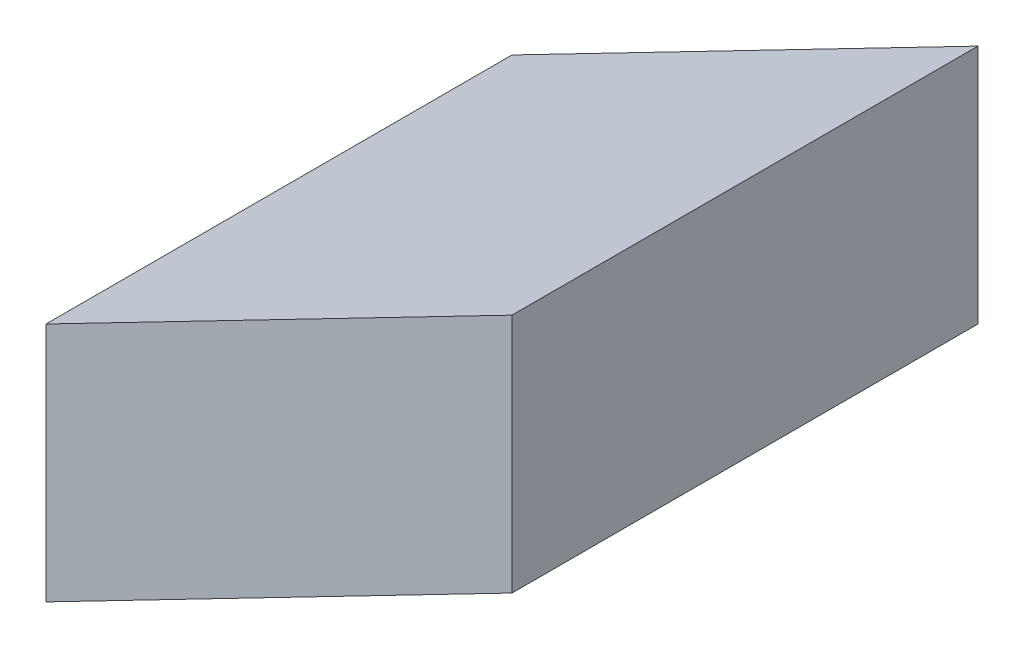
ISO-10303-21;
HEADER;
FILE_DESCRIPTION(('STEP AP214'),'2;1');
FILE_NAME('part.step','',(''),(''),'','','');
FILE_SCHEMA(('AUTOMOTIVE_DESIGN { 1 0 10303 214 1 1 1 1 }'));
ENDSEC;
DATA;
#1=APPLICATION_CONTEXT('core data for automotive mechanical design processes');
#2=APPLICATION_PROTOCOL_DEFINITION('international standard','automotive_design',2000,#1);
#3=PRODUCT_CONTEXT('',#1,'mechanical');
#4=PRODUCT('Part','Part','',(#3));
#5=PRODUCT_RELATED_PRODUCT_CATEGORY('part','',(#4));
#6=PRODUCT_DEFINITION_FORMATION('','',#4);
#7=PRODUCT_DEFINITION_CONTEXT('part definition',#1,'design');
#8=PRODUCT_DEFINITION('design','',#6,#7);
#9=PRODUCT_DEFINITION_SHAPE('','',#8);
#10=(LENGTH_UNIT() NAMED_UNIT(*) SI_UNIT(.MILLI.,.METRE.));
#11=(NAMED_UNIT(*) PLANE_ANGLE_UNIT() SI_UNIT($,.RADIAN.));
#12=(NAMED_UNIT(*) SI_UNIT($,.STERADIAN.) SOLID_ANGLE_UNIT());
#13=UNCERTAINTY_MEASURE_WITH_UNIT(LENGTH_MEASURE(1.E-05),#10,'distance_accuracy_value','');
#14=(GEOMETRIC_REPRESENTATION_CONTEXT(3) GLOBAL_UNCERTAINTY_ASSIGNED_CONTEXT((#13)) GLOBAL_UNIT_ASSIGNED_CONTEXT((#10,
#11,#12)) REPRESENTATION_CONTEXT('',''));
#15=CARTESIAN_POINT('',(0.,0.,0.));
#16=DIRECTION('',(0.,0.,1.));
#17=DIRECTION('',(1.,0.,0.));
#18=AXIS2_PLACEMENT_3D('',#15,#16,#17);
#19=CARTESIAN_POINT('',(0.,50.8,-12192.));
#20=DIRECTION('',(1.,0.,0.));
#21=DIRECTION('',(0.,0.,-1.));
#22=AXIS2_PLACEMENT_3D('',#19,#20,#21);
#23=PLANE('',#22);
#24=DIRECTION('',(0.,0.,-1.));
#25=VECTOR('',#24,1.);
#26=CARTESIAN_POINT('',(0.,4572.,-12192.));
#27=LINE('',#26,#25);
#28=CARTESIAN_POINT('',(4.7679880361686E-12,4572.,-12192.));
#29=VERTEX_POINT('',#28);
#30=CARTESIAN_POINT('',(0.,4572.,-12242.8));
#31=VERTEX_POINT('',#30);
#32=EDGE_CURVE('E77',#29,#31,#27,.T.);
#33=ORIENTED_EDGE('',*,*,#32,.T.);
#34=DIRECTION('',(0.,1.,0.));
#35=VECTOR('',#34,1.);
#36=CARTESIAN_POINT('',(0.,0.,-12242.8));
#37=LINE('',#36,#35);
#38=CARTESIAN_POINT('',(0.,4598.23678906917,-12242.8));
#39=VERTEX_POINT('',#38);
#40=EDGE_CURVE('E85',#31,#39,#37,.T.);
#41=ORIENTED_EDGE('',*,*,#40,.T.);
#42=DIRECTION('',(0.,0.,-1.));
#43=VECTOR('',#42,1.);
#44=CARTESIAN_POINT('',(0.,4598.23678906917,-26022.0350141595));
#45=LINE('',#44,#43);
#46=CARTESIAN_POINT('',(0.,4598.23678906917,-12192.));
#47=VERTEX_POINT('',#46);
#48=EDGE_CURVE('E57',#47,#39,#45,.T.);
#49=ORIENTED_EDGE('',*,*,#48,.F.);
#50=DIRECTION('',(0.,-1.,0.));
#51=VECTOR('',#50,1.);
#52=CARTESIAN_POINT('',(0.,50.8,-12192.));
#53=LINE('',#52,#51);
#54=EDGE_CURVE('E86',#47,#29,#53,.T.);
#55=ORIENTED_EDGE('',*,*,#54,.T.);
#56=EDGE_LOOP('',(#33,#41,#49,#55));
#57=FACE_BOUND('',#56,.T.);
#58=ADVANCED_FACE('F34',(#57),#23,.T.);
#59=CARTESIAN_POINT('',(4.7679880361686E-12,4572.,-12192.));
#60=DIRECTION('',(0.458883686879013,-0.888496348848055,0.));
#61=DIRECTION('',(0.888496348848055,0.458883686879013,0.));
#62=AXIS2_PLACEMENT_3D('',#59,#60,#61);
#63=PLANE('',#62);
#64=DIRECTION('',(0.888496348848055,0.458883686879013,0.));
#65=VECTOR('',#64,1.);
#66=CARTESIAN_POINT('',(12192.,10868.8293766007,-12192.));
#67=LINE('',#66,#65);
#68=CARTESIAN_POINT('',(-50.8000000000003,4545.76321093083,-12192.));
#69=VERTEX_POINT('',#68);
#70=EDGE_CURVE('E38',#69,#29,#67,.T.);
#71=ORIENTED_EDGE('',*,*,#70,.F.);
#72=DIRECTION('',(0.,0.,-1.));
#73=VECTOR('',#72,1.);
#74=CARTESIAN_POINT('',(-50.8,4545.76321093083,0.));
#75=LINE('',#74,#73);
#76=CARTESIAN_POINT('',(-50.8000000000001,4545.76321093083,-12242.8));
#77=VERTEX_POINT('',#76);
#78=EDGE_CURVE('E97',#69,#77,#75,.T.);
#79=ORIENTED_EDGE('',*,*,#78,.T.);
#80=DIRECTION('',(0.888496348848055,0.458883686879013,0.));
#81=VECTOR('',#80,1.);
#82=CARTESIAN_POINT('',(-1864.07974810505,3609.25458348143,-12242.8));
#83=LINE('',#82,#81);
#84=EDGE_CURVE('E82',#77,#31,#83,.T.);
#85=ORIENTED_EDGE('',*,*,#84,.T.);
#86=ORIENTED_EDGE('',*,*,#32,.F.);
#87=EDGE_LOOP('',(#71,#79,#85,#86));
#88=FACE_BOUND('',#87,.T.);
#89=ADVANCED_FACE('F79',(#88),#63,.T.);
#90=CARTESIAN_POINT('',(12192.,10868.8293766007,-12192.));
#91=DIRECTION('',(0.,0.,1.));
#92=DIRECTION('',(1.,0.,0.));
#93=AXIS2_PLACEMENT_3D('',#90,#91,#92);
#94=PLANE('',#93);
#95=DIRECTION('',(0.888496348848055,0.458883686879013,0.));
#96=VECTOR('',#95,1.);
#97=CARTESIAN_POINT('',(-50.8,4572.,-12192.));
#98=LINE('',#97,#96);
#99=CARTESIAN_POINT('',(-50.8,4572.,-12192.));
#100=VERTEX_POINT('',#99);
#101=EDGE_CURVE('E94',#100,#47,#98,.T.);
#102=ORIENTED_EDGE('',*,*,#101,.F.);
#103=DIRECTION('',(0.,-1.,0.));
#104=VECTOR('',#103,1.);
#105=CARTESIAN_POINT('',(-50.8,0.,-12192.));
#106=LINE('',#105,#104);
#107=EDGE_CURVE('E93',#100,#69,#106,.T.);
#108=ORIENTED_EDGE('',*,*,#107,.T.);
#109=ORIENTED_EDGE('',*,*,#70,.T.);
#110=ORIENTED_EDGE('',*,*,#54,.F.);
#111=EDGE_LOOP('',(#102,#108,#109,#110));
#112=FACE_BOUND('',#111,.T.);
#113=ADVANCED_FACE('F91',(#112),#94,.T.);
#114=CARTESIAN_POINT('',(0.,0.,-12242.8));
#115=DIRECTION('',(0.,0.,1.));
#116=DIRECTION('',(1.,0.,0.));
#117=AXIS2_PLACEMENT_3D('',#114,#115,#116);
#118=PLANE('',#117);
#119=ORIENTED_EDGE('',*,*,#84,.F.);
#120=DIRECTION('',(0.,1.,0.));
#121=VECTOR('',#120,1.);
#122=CARTESIAN_POINT('',(-50.8,0.,-12242.8));
#123=LINE('',#122,#121);
#124=CARTESIAN_POINT('',(-50.8,4572.,-12242.8));
#125=VERTEX_POINT('',#124);
#126=EDGE_CURVE('E43',#77,#125,#123,.T.);
#127=ORIENTED_EDGE('',*,*,#126,.T.);
#128=DIRECTION('',(0.888496348848055,0.458883686879013,0.));
#129=VECTOR('',#128,1.);
#130=CARTESIAN_POINT('',(-50.8,4572.,-12242.8));
#131=LINE('',#130,#129);
#132=EDGE_CURVE('E11',#125,#39,#131,.T.);
#133=ORIENTED_EDGE('',*,*,#132,.T.);
#134=ORIENTED_EDGE('',*,*,#40,.F.);
#135=EDGE_LOOP('',(#119,#127,#133,#134));
#136=FACE_BOUND('',#135,.T.);
#137=ADVANCED_FACE('F107',(#136),#118,.F.);
#138=CARTESIAN_POINT('',(-50.8,0.,0.));
#139=DIRECTION('',(1.,0.,0.));
#140=DIRECTION('',(0.,0.,-1.));
#141=AXIS2_PLACEMENT_3D('',#138,#139,#140);
#142=PLANE('',#141);
#143=ORIENTED_EDGE('',*,*,#78,.F.);
#144=ORIENTED_EDGE('',*,*,#107,.F.);
#145=DIRECTION('',(0.,0.,-1.));
#146=VECTOR('',#145,1.);
#147=CARTESIAN_POINT('',(-50.8,4572.,-12192.));
#148=LINE('',#147,#146);
#149=EDGE_CURVE('E103',#100,#125,#148,.T.);
#150=ORIENTED_EDGE('',*,*,#149,.T.);
#151=ORIENTED_EDGE('',*,*,#126,.F.);
#152=EDGE_LOOP('',(#143,#144,#150,#151));
#153=FACE_BOUND('',#152,.T.);
#154=ADVANCED_FACE('F36',(#153),#142,.F.);
#155=CARTESIAN_POINT('',(-50.8,4572.,-26022.0350141595));
#156=DIRECTION('',(-0.458883686879013,0.888496348848055,0.));
#157=DIRECTION('',(-0.888496348848055,-0.458883686879013,0.));
#158=AXIS2_PLACEMENT_3D('',#155,#156,#157);
#159=PLANE('',#158);
#160=ORIENTED_EDGE('',*,*,#149,.F.);
#161=ORIENTED_EDGE('',*,*,#101,.T.);
#162=ORIENTED_EDGE('',*,*,#48,.T.);
#163=ORIENTED_EDGE('',*,*,#132,.F.);
#164=EDGE_LOOP('',(#160,#161,#162,#163));
#165=FACE_BOUND('',#164,.T.);
#166=ADVANCED_FACE('F108',(#165),#159,.T.);
#167=CLOSED_SHELL('',(#58,#89,#113,#137,#154,#166));
#168=MANIFOLD_SOLID_BREP('B2',#167);
#169=ADVANCED_BREP_SHAPE_REPRESENTATION('',(#18,#168),#14);
#170=SHAPE_DEFINITION_REPRESENTATION(#9,#169);
ENDSEC;
END-ISO-10303-21;
